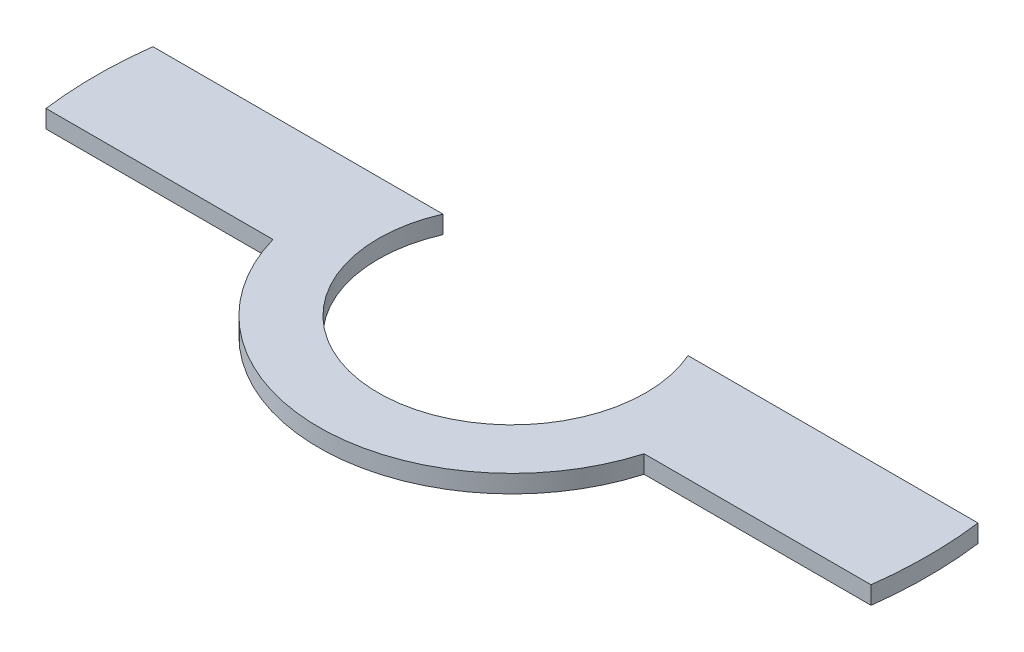
ISO-10303-21;
HEADER;
FILE_DESCRIPTION(('STEP AP214'),'2;1');
FILE_NAME('part.step','',(''),(''),'','','');
FILE_SCHEMA(('AUTOMOTIVE_DESIGN { 1 0 10303 214 1 1 1 1 }'));
ENDSEC;
DATA;
#1=APPLICATION_CONTEXT('core data for automotive mechanical design processes');
#2=APPLICATION_PROTOCOL_DEFINITION('international standard','automotive_design',2000,#1);
#3=PRODUCT_CONTEXT('',#1,'mechanical');
#4=PRODUCT('Part','Part','',(#3));
#5=PRODUCT_RELATED_PRODUCT_CATEGORY('part','',(#4));
#6=PRODUCT_DEFINITION_FORMATION('','',#4);
#7=PRODUCT_DEFINITION_CONTEXT('part definition',#1,'design');
#8=PRODUCT_DEFINITION('design','',#6,#7);
#9=PRODUCT_DEFINITION_SHAPE('','',#8);
#10=(LENGTH_UNIT() NAMED_UNIT(*) SI_UNIT(.MILLI.,.METRE.));
#11=(NAMED_UNIT(*) PLANE_ANGLE_UNIT() SI_UNIT($,.RADIAN.));
#12=(NAMED_UNIT(*) SI_UNIT($,.STERADIAN.) SOLID_ANGLE_UNIT());
#13=UNCERTAINTY_MEASURE_WITH_UNIT(LENGTH_MEASURE(1.E-05),#10,'distance_accuracy_value','');
#14=(GEOMETRIC_REPRESENTATION_CONTEXT(3) GLOBAL_UNCERTAINTY_ASSIGNED_CONTEXT((#13)) GLOBAL_UNIT_ASSIGNED_CONTEXT((#10,
#11,#12)) REPRESENTATION_CONTEXT('',''));
#15=CARTESIAN_POINT('',(0.,0.,0.));
#16=DIRECTION('',(0.,0.,1.));
#17=DIRECTION('',(1.,0.,0.));
#18=AXIS2_PLACEMENT_3D('',#15,#16,#17);
#19=CARTESIAN_POINT('',(0.,3.,0.));
#20=DIRECTION('',(0.,-1.,0.));
#21=DIRECTION('',(0.,0.,-1.));
#22=AXIS2_PLACEMENT_3D('',#19,#20,#21);
#23=CYLINDRICAL_SURFACE('',#22,32.5);
#24=CARTESIAN_POINT('',(0.,0.,0.));
#25=DIRECTION('',(0.,1.,0.));
#26=DIRECTION('',(0.,0.,1.));
#27=AXIS2_PLACEMENT_3D('',#24,#25,#26);
#28=CIRCLE('',#27,32.5);
#29=CARTESIAN_POINT('',(-31.2289929392544,0.,9.));
#30=VERTEX_POINT('',#29);
#31=CARTESIAN_POINT('',(31.2289929392544,0.,9.));
#32=VERTEX_POINT('',#31);
#33=EDGE_CURVE('E128',#30,#32,#28,.T.);
#34=ORIENTED_EDGE('',*,*,#33,.T.);
#35=DIRECTION('',(0.,-1.,0.));
#36=VECTOR('',#35,1.);
#37=CARTESIAN_POINT('',(31.2289929392544,3.,9.));
#38=LINE('',#37,#36);
#39=CARTESIAN_POINT('',(31.2289929392544,3.,9.));
#40=VERTEX_POINT('',#39);
#41=EDGE_CURVE('E11',#40,#32,#38,.T.);
#42=ORIENTED_EDGE('',*,*,#41,.F.);
#43=CARTESIAN_POINT('',(0.,3.,0.));
#44=DIRECTION('',(0.,1.,0.));
#45=DIRECTION('',(0.,0.,1.));
#46=AXIS2_PLACEMENT_3D('',#43,#44,#45);
#47=CIRCLE('',#46,32.5);
#48=CARTESIAN_POINT('',(-31.2289929392544,3.,9.));
#49=VERTEX_POINT('',#48);
#50=EDGE_CURVE('E142',#49,#40,#47,.T.);
#51=ORIENTED_EDGE('',*,*,#50,.F.);
#52=DIRECTION('',(0.,-1.,0.));
#53=VECTOR('',#52,1.);
#54=CARTESIAN_POINT('',(-31.2289929392544,3.,9.));
#55=LINE('',#54,#53);
#56=EDGE_CURVE('E124',#49,#30,#55,.T.);
#57=ORIENTED_EDGE('',*,*,#56,.T.);
#58=EDGE_LOOP('',(#34,#42,#51,#57));
#59=FACE_BOUND('',#58,.T.);
#60=ADVANCED_FACE('F32',(#59),#23,.T.);
#61=CARTESIAN_POINT('',(31.2289929392544,3.,9.));
#62=DIRECTION('',(0.,0.,-1.));
#63=DIRECTION('',(-1.,0.,0.));
#64=AXIS2_PLACEMENT_3D('',#61,#62,#63);
#65=PLANE('',#64);
#66=DIRECTION('',(1.,0.,0.));
#67=VECTOR('',#66,1.);
#68=CARTESIAN_POINT('',(31.2289929392544,0.,9.));
#69=LINE('',#68,#67);
#70=CARTESIAN_POINT('',(69.4190175672344,0.,9.));
#71=VERTEX_POINT('',#70);
#72=EDGE_CURVE('E131',#32,#71,#69,.T.);
#73=ORIENTED_EDGE('',*,*,#72,.T.);
#74=DIRECTION('',(0.,-1.,0.));
#75=VECTOR('',#74,1.);
#76=CARTESIAN_POINT('',(69.4190175672344,3.,9.));
#77=LINE('',#76,#75);
#78=CARTESIAN_POINT('',(69.4190175672344,3.,9.));
#79=VERTEX_POINT('',#78);
#80=EDGE_CURVE('E40',#79,#71,#77,.T.);
#81=ORIENTED_EDGE('',*,*,#80,.F.);
#82=DIRECTION('',(1.,0.,0.));
#83=VECTOR('',#82,1.);
#84=CARTESIAN_POINT('',(31.2289929392544,3.,9.));
#85=LINE('',#84,#83);
#86=EDGE_CURVE('E91',#40,#79,#85,.T.);
#87=ORIENTED_EDGE('',*,*,#86,.F.);
#88=ORIENTED_EDGE('',*,*,#41,.T.);
#89=EDGE_LOOP('',(#73,#81,#87,#88));
#90=FACE_BOUND('',#89,.T.);
#91=ADVANCED_FACE('F177',(#90),#65,.F.);
#92=CARTESIAN_POINT('',(0.,3.,0.));
#93=DIRECTION('',(0.,-1.,0.));
#94=DIRECTION('',(0.,0.,-1.));
#95=AXIS2_PLACEMENT_3D('',#92,#93,#94);
#96=CYLINDRICAL_SURFACE('',#95,70.);
#97=CARTESIAN_POINT('',(0.,0.,0.));
#98=DIRECTION('',(0.,1.,0.));
#99=DIRECTION('',(0.,0.,1.));
#100=AXIS2_PLACEMENT_3D('',#97,#98,#99);
#101=CIRCLE('',#100,70.);
#102=CARTESIAN_POINT('',(69.4190175672344,0.,-9.));
#103=VERTEX_POINT('',#102);
#104=EDGE_CURVE('E133',#71,#103,#101,.T.);
#105=ORIENTED_EDGE('',*,*,#104,.T.);
#106=DIRECTION('',(0.,-1.,0.));
#107=VECTOR('',#106,1.);
#108=CARTESIAN_POINT('',(69.4190175672344,3.,-9.));
#109=LINE('',#108,#107);
#110=CARTESIAN_POINT('',(69.4190175672344,3.,-9.));
#111=VERTEX_POINT('',#110);
#112=EDGE_CURVE('E149',#111,#103,#109,.T.);
#113=ORIENTED_EDGE('',*,*,#112,.F.);
#114=CARTESIAN_POINT('',(0.,3.,0.));
#115=DIRECTION('',(0.,1.,0.));
#116=DIRECTION('',(0.,0.,1.));
#117=AXIS2_PLACEMENT_3D('',#114,#115,#116);
#118=CIRCLE('',#117,70.);
#119=EDGE_CURVE('E157',#79,#111,#118,.T.);
#120=ORIENTED_EDGE('',*,*,#119,.F.);
#121=ORIENTED_EDGE('',*,*,#80,.T.);
#122=EDGE_LOOP('',(#105,#113,#120,#121));
#123=FACE_BOUND('',#122,.T.);
#124=ADVANCED_FACE('F155',(#123),#96,.T.);
#125=CARTESIAN_POINT('',(20.6215906273013,3.,-9.));
#126=DIRECTION('',(0.,0.,1.));
#127=DIRECTION('',(1.,0.,0.));
#128=AXIS2_PLACEMENT_3D('',#125,#126,#127);
#129=PLANE('',#128);
#130=DIRECTION('',(-1.,0.,0.));
#131=VECTOR('',#130,1.);
#132=CARTESIAN_POINT('',(20.6215906273013,0.,-9.));
#133=LINE('',#132,#131);
#134=CARTESIAN_POINT('',(20.6215906273013,0.,-9.));
#135=VERTEX_POINT('',#134);
#136=EDGE_CURVE('E135',#103,#135,#133,.T.);
#137=ORIENTED_EDGE('',*,*,#136,.T.);
#138=DIRECTION('',(0.,-1.,0.));
#139=VECTOR('',#138,1.);
#140=CARTESIAN_POINT('',(20.6215906273013,3.,-9.));
#141=LINE('',#140,#139);
#142=CARTESIAN_POINT('',(20.6215906273013,3.,-9.));
#143=VERTEX_POINT('',#142);
#144=EDGE_CURVE('E146',#143,#135,#141,.T.);
#145=ORIENTED_EDGE('',*,*,#144,.F.);
#146=DIRECTION('',(-1.,0.,0.));
#147=VECTOR('',#146,1.);
#148=CARTESIAN_POINT('',(20.6215906273013,3.,-9.));
#149=LINE('',#148,#147);
#150=EDGE_CURVE('E169',#111,#143,#149,.T.);
#151=ORIENTED_EDGE('',*,*,#150,.F.);
#152=ORIENTED_EDGE('',*,*,#112,.T.);
#153=EDGE_LOOP('',(#137,#145,#151,#152));
#154=FACE_BOUND('',#153,.T.);
#155=ADVANCED_FACE('F165',(#154),#129,.F.);
#156=CARTESIAN_POINT('',(0.,3.,0.));
#157=DIRECTION('',(0.,-1.,0.));
#158=DIRECTION('',(0.,0.,-1.));
#159=AXIS2_PLACEMENT_3D('',#156,#157,#158);
#160=CYLINDRICAL_SURFACE('',#159,22.5);
#161=CARTESIAN_POINT('',(0.,0.,0.));
#162=DIRECTION('',(0.,-1.,0.));
#163=DIRECTION('',(0.,0.,1.));
#164=AXIS2_PLACEMENT_3D('',#161,#162,#163);
#165=CIRCLE('',#164,22.5);
#166=CARTESIAN_POINT('',(-20.6215906273013,0.,-9.));
#167=VERTEX_POINT('',#166);
#168=EDGE_CURVE('E137',#135,#167,#165,.T.);
#169=ORIENTED_EDGE('',*,*,#168,.T.);
#170=DIRECTION('',(0.,-1.,0.));
#171=VECTOR('',#170,1.);
#172=CARTESIAN_POINT('',(-20.6215906273013,3.,-9.));
#173=LINE('',#172,#171);
#174=CARTESIAN_POINT('',(-20.6215906273013,3.,-9.));
#175=VERTEX_POINT('',#174);
#176=EDGE_CURVE('E119',#175,#167,#173,.T.);
#177=ORIENTED_EDGE('',*,*,#176,.F.);
#178=CARTESIAN_POINT('',(0.,3.,0.));
#179=DIRECTION('',(0.,-1.,0.));
#180=DIRECTION('',(0.,0.,1.));
#181=AXIS2_PLACEMENT_3D('',#178,#179,#180);
#182=CIRCLE('',#181,22.5);
#183=EDGE_CURVE('E110',#143,#175,#182,.T.);
#184=ORIENTED_EDGE('',*,*,#183,.F.);
#185=ORIENTED_EDGE('',*,*,#144,.T.);
#186=EDGE_LOOP('',(#169,#177,#184,#185));
#187=FACE_BOUND('',#186,.T.);
#188=ADVANCED_FACE('F168',(#187),#160,.F.);
#189=CARTESIAN_POINT('',(-20.6215906273013,3.,-9.));
#190=DIRECTION('',(0.,0.,1.));
#191=DIRECTION('',(1.,0.,0.));
#192=AXIS2_PLACEMENT_3D('',#189,#190,#191);
#193=PLANE('',#192);
#194=DIRECTION('',(-1.,0.,0.));
#195=VECTOR('',#194,1.);
#196=CARTESIAN_POINT('',(-20.6215906273013,0.,-9.));
#197=LINE('',#196,#195);
#198=CARTESIAN_POINT('',(-69.4190175672344,0.,-9.));
#199=VERTEX_POINT('',#198);
#200=EDGE_CURVE('E118',#167,#199,#197,.T.);
#201=ORIENTED_EDGE('',*,*,#200,.T.);
#202=DIRECTION('',(0.,-1.,0.));
#203=VECTOR('',#202,1.);
#204=CARTESIAN_POINT('',(-69.4190175672344,3.,-9.));
#205=LINE('',#204,#203);
#206=CARTESIAN_POINT('',(-69.4190175672344,3.,-9.));
#207=VERTEX_POINT('',#206);
#208=EDGE_CURVE('E115',#207,#199,#205,.T.);
#209=ORIENTED_EDGE('',*,*,#208,.F.);
#210=DIRECTION('',(-1.,0.,0.));
#211=VECTOR('',#210,1.);
#212=CARTESIAN_POINT('',(-20.6215906273013,3.,-9.));
#213=LINE('',#212,#211);
#214=EDGE_CURVE('E104',#175,#207,#213,.T.);
#215=ORIENTED_EDGE('',*,*,#214,.F.);
#216=ORIENTED_EDGE('',*,*,#176,.T.);
#217=EDGE_LOOP('',(#201,#209,#215,#216));
#218=FACE_BOUND('',#217,.T.);
#219=ADVANCED_FACE('F116',(#218),#193,.F.);
#220=CARTESIAN_POINT('',(0.,3.,0.));
#221=DIRECTION('',(0.,-1.,0.));
#222=DIRECTION('',(0.,0.,-1.));
#223=AXIS2_PLACEMENT_3D('',#220,#221,#222);
#224=CYLINDRICAL_SURFACE('',#223,70.);
#225=CARTESIAN_POINT('',(0.,0.,0.));
#226=DIRECTION('',(0.,1.,0.));
#227=DIRECTION('',(0.,0.,1.));
#228=AXIS2_PLACEMENT_3D('',#225,#226,#227);
#229=CIRCLE('',#228,70.);
#230=CARTESIAN_POINT('',(-69.4190175672344,0.,9.00000000000001));
#231=VERTEX_POINT('',#230);
#232=EDGE_CURVE('E77',#199,#231,#229,.T.);
#233=ORIENTED_EDGE('',*,*,#232,.T.);
#234=DIRECTION('',(0.,-1.,0.));
#235=VECTOR('',#234,1.);
#236=CARTESIAN_POINT('',(-69.4190175672344,3.,9.00000000000001));
#237=LINE('',#236,#235);
#238=CARTESIAN_POINT('',(-69.4190175672344,3.,9.00000000000001));
#239=VERTEX_POINT('',#238);
#240=EDGE_CURVE('E120',#239,#231,#237,.T.);
#241=ORIENTED_EDGE('',*,*,#240,.F.);
#242=CARTESIAN_POINT('',(0.,3.,0.));
#243=DIRECTION('',(0.,1.,0.));
#244=DIRECTION('',(0.,0.,1.));
#245=AXIS2_PLACEMENT_3D('',#242,#243,#244);
#246=CIRCLE('',#245,70.);
#247=EDGE_CURVE('E108',#207,#239,#246,.T.);
#248=ORIENTED_EDGE('',*,*,#247,.F.);
#249=ORIENTED_EDGE('',*,*,#208,.T.);
#250=EDGE_LOOP('',(#233,#241,#248,#249));
#251=FACE_BOUND('',#250,.T.);
#252=ADVANCED_FACE('F122',(#251),#224,.T.);
#253=CARTESIAN_POINT('',(-31.2289929392544,3.,9.));
#254=DIRECTION('',(0.,0.,-1.));
#255=DIRECTION('',(-1.,0.,0.));
#256=AXIS2_PLACEMENT_3D('',#253,#254,#255);
#257=PLANE('',#256);
#258=DIRECTION('',(1.,0.,0.));
#259=VECTOR('',#258,1.);
#260=CARTESIAN_POINT('',(-31.2289929392544,0.,9.));
#261=LINE('',#260,#259);
#262=EDGE_CURVE('E83',#231,#30,#261,.T.);
#263=ORIENTED_EDGE('',*,*,#262,.T.);
#264=ORIENTED_EDGE('',*,*,#56,.F.);
#265=DIRECTION('',(1.,0.,0.));
#266=VECTOR('',#265,1.);
#267=CARTESIAN_POINT('',(-31.2289929392544,3.,9.));
#268=LINE('',#267,#266);
#269=EDGE_CURVE('E48',#239,#49,#268,.T.);
#270=ORIENTED_EDGE('',*,*,#269,.F.);
#271=ORIENTED_EDGE('',*,*,#240,.T.);
#272=EDGE_LOOP('',(#263,#264,#270,#271));
#273=FACE_BOUND('',#272,.T.);
#274=ADVANCED_FACE('F193',(#273),#257,.F.);
#275=CARTESIAN_POINT('',(0.,3.,0.));
#276=DIRECTION('',(0.,1.,0.));
#277=DIRECTION('',(0.,0.,1.));
#278=AXIS2_PLACEMENT_3D('',#275,#276,#277);
#279=PLANE('',#278);
#280=ORIENTED_EDGE('',*,*,#50,.T.);
#281=ORIENTED_EDGE('',*,*,#86,.T.);
#282=ORIENTED_EDGE('',*,*,#119,.T.);
#283=ORIENTED_EDGE('',*,*,#150,.T.);
#284=ORIENTED_EDGE('',*,*,#183,.T.);
#285=ORIENTED_EDGE('',*,*,#214,.T.);
#286=ORIENTED_EDGE('',*,*,#247,.T.);
#287=ORIENTED_EDGE('',*,*,#269,.T.);
#288=EDGE_LOOP('',(#280,#281,#282,#283,#284,#285,#286,#287));
#289=FACE_BOUND('',#288,.T.);
#290=ADVANCED_FACE('F106',(#289),#279,.T.);
#291=CARTESIAN_POINT('',(0.,0.,0.));
#292=DIRECTION('',(0.,1.,0.));
#293=DIRECTION('',(0.,0.,1.));
#294=AXIS2_PLACEMENT_3D('',#291,#292,#293);
#295=PLANE('',#294);
#296=ORIENTED_EDGE('',*,*,#33,.F.);
#297=ORIENTED_EDGE('',*,*,#262,.F.);
#298=ORIENTED_EDGE('',*,*,#232,.F.);
#299=ORIENTED_EDGE('',*,*,#200,.F.);
#300=ORIENTED_EDGE('',*,*,#168,.F.);
#301=ORIENTED_EDGE('',*,*,#136,.F.);
#302=ORIENTED_EDGE('',*,*,#104,.F.);
#303=ORIENTED_EDGE('',*,*,#72,.F.);
#304=EDGE_LOOP('',(#296,#297,#298,#299,#300,#301,#302,#303));
#305=FACE_BOUND('',#304,.T.);
#306=ADVANCED_FACE('F161',(#305),#295,.F.);
#307=CLOSED_SHELL('',(#60,#91,#124,#155,#188,#219,#252,#274,#290,#306));
#308=MANIFOLD_SOLID_BREP('B2',#307);
#309=ADVANCED_BREP_SHAPE_REPRESENTATION('',(#18,#308),#14);
#310=SHAPE_DEFINITION_REPRESENTATION(#9,#309);
ENDSEC;
END-ISO-10303-21;
